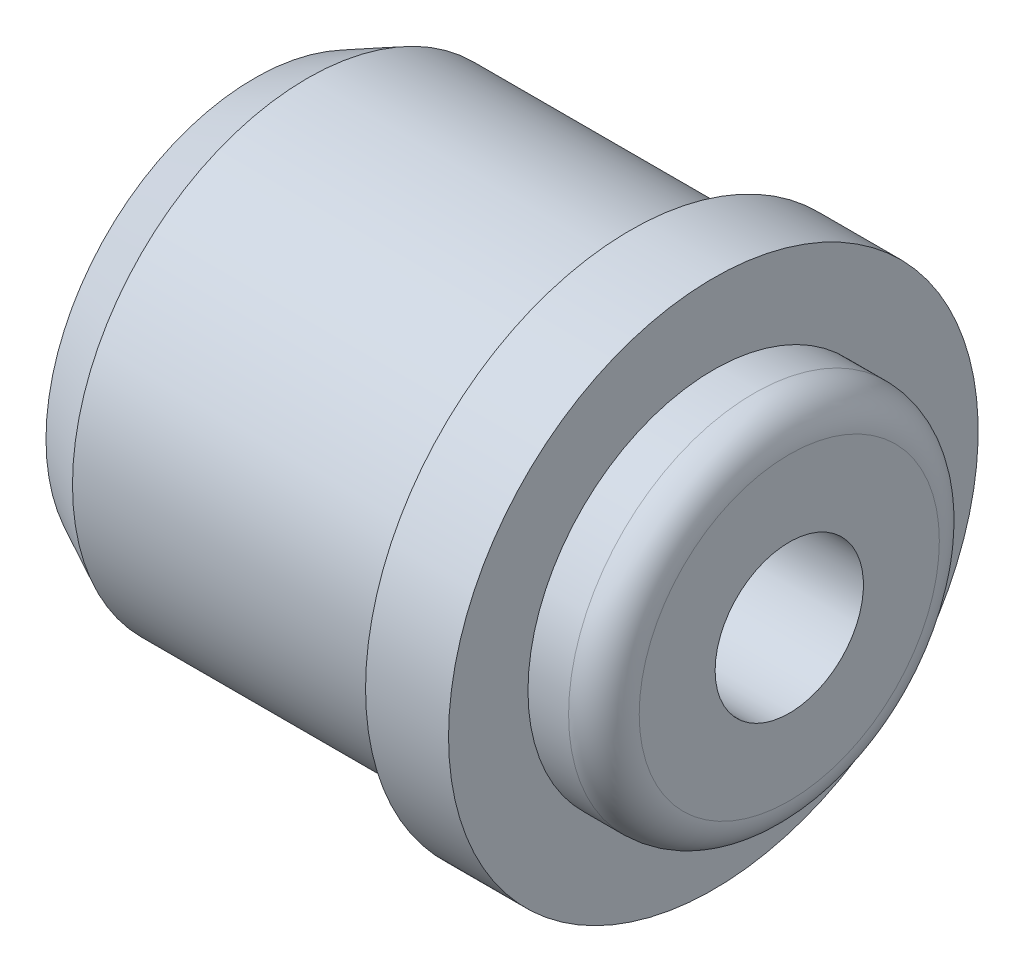
ISO-10303-21;
HEADER;
FILE_DESCRIPTION(('STEP AP214'),'2;1');
FILE_NAME('part.step','',(''),(''),'','','');
FILE_SCHEMA(('AUTOMOTIVE_DESIGN { 1 0 10303 214 1 1 1 1 }'));
ENDSEC;
DATA;
#1=APPLICATION_CONTEXT('core data for automotive mechanical design processes');
#2=APPLICATION_PROTOCOL_DEFINITION('international standard','automotive_design',2000,#1);
#3=PRODUCT_CONTEXT('',#1,'mechanical');
#4=PRODUCT('Part','Part','',(#3));
#5=PRODUCT_RELATED_PRODUCT_CATEGORY('part','',(#4));
#6=PRODUCT_DEFINITION_FORMATION('','',#4);
#7=PRODUCT_DEFINITION_CONTEXT('part definition',#1,'design');
#8=PRODUCT_DEFINITION('design','',#6,#7);
#9=PRODUCT_DEFINITION_SHAPE('','',#8);
#10=(LENGTH_UNIT() NAMED_UNIT(*) SI_UNIT(.MILLI.,.METRE.));
#11=(NAMED_UNIT(*) PLANE_ANGLE_UNIT() SI_UNIT($,.RADIAN.));
#12=(NAMED_UNIT(*) SI_UNIT($,.STERADIAN.) SOLID_ANGLE_UNIT());
#13=UNCERTAINTY_MEASURE_WITH_UNIT(LENGTH_MEASURE(1.E-05),#10,'distance_accuracy_value','');
#14=(GEOMETRIC_REPRESENTATION_CONTEXT(3) GLOBAL_UNCERTAINTY_ASSIGNED_CONTEXT((#13)) GLOBAL_UNIT_ASSIGNED_CONTEXT((#10,
#11,#12)) REPRESENTATION_CONTEXT('',''));
#15=CARTESIAN_POINT('',(0.,0.,0.));
#16=DIRECTION('',(0.,0.,1.));
#17=DIRECTION('',(1.,0.,0.));
#18=AXIS2_PLACEMENT_3D('',#15,#16,#17);
#19=CARTESIAN_POINT('',(-62.970585651958,0.,0.));
#20=DIRECTION('',(-1.,0.,0.));
#21=DIRECTION('',(0.,0.,1.));
#22=AXIS2_PLACEMENT_3D('',#19,#20,#21);
#23=CYLINDRICAL_SURFACE('',#22,11.3);
#24=CARTESIAN_POINT('',(-6.3,0.,0.));
#25=DIRECTION('',(-1.,0.,0.));
#26=DIRECTION('',(0.,0.,1.));
#27=AXIS2_PLACEMENT_3D('',#24,#25,#26);
#28=CIRCLE('',#27,11.3);
#29=CARTESIAN_POINT('',(-6.3,0.,11.3));
#30=VERTEX_POINT('',#29);
#31=EDGE_CURVE('E41',#30,#30,#28,.T.);
#32=ORIENTED_EDGE('',*,*,#31,.F.);
#33=EDGE_LOOP('',(#32));
#34=FACE_BOUND('',#33,.T.);
#35=CARTESIAN_POINT('',(-30.3,0.,0.));
#36=DIRECTION('',(-1.,0.,0.));
#37=DIRECTION('',(0.,0.,1.));
#38=AXIS2_PLACEMENT_3D('',#35,#36,#37);
#39=CIRCLE('',#38,11.3);
#40=CARTESIAN_POINT('',(-30.3,0.,11.3));
#41=VERTEX_POINT('',#40);
#42=EDGE_CURVE('E86',#41,#41,#39,.T.);
#43=ORIENTED_EDGE('',*,*,#42,.T.);
#44=EDGE_LOOP('',(#43));
#45=FACE_BOUND('',#44,.T.);
#46=ADVANCED_FACE('F31',(#34,#45),#23,.F.);
#47=CARTESIAN_POINT('',(-6.3,8.75,0.));
#48=DIRECTION('',(1.,0.,0.));
#49=DIRECTION('',(0.,0.,-1.));
#50=AXIS2_PLACEMENT_3D('',#47,#48,#49);
#51=PLANE('',#50);
#52=CARTESIAN_POINT('',(-6.3,0.,0.));
#53=DIRECTION('',(-1.,0.,0.));
#54=DIRECTION('',(0.,0.,1.));
#55=AXIS2_PLACEMENT_3D('',#52,#53,#54);
#56=CIRCLE('',#55,8.75);
#57=CARTESIAN_POINT('',(-6.3,0.,8.75));
#58=VERTEX_POINT('',#57);
#59=EDGE_CURVE('E45',#58,#58,#56,.T.);
#60=ORIENTED_EDGE('',*,*,#59,.F.);
#61=EDGE_LOOP('',(#60));
#62=FACE_BOUND('',#61,.T.);
#63=ORIENTED_EDGE('',*,*,#31,.T.);
#64=EDGE_LOOP('',(#63));
#65=FACE_BOUND('',#64,.T.);
#66=ADVANCED_FACE('F138',(#62,#65),#51,.F.);
#67=CARTESIAN_POINT('',(-62.970585651958,0.,0.));
#68=DIRECTION('',(-1.,0.,0.));
#69=DIRECTION('',(0.,0.,1.));
#70=AXIS2_PLACEMENT_3D('',#67,#68,#69);
#71=CYLINDRICAL_SURFACE('',#70,8.75);
#72=CARTESIAN_POINT('',(-20.8,0.,0.));
#73=DIRECTION('',(-1.,0.,0.));
#74=DIRECTION('',(0.,0.,1.));
#75=AXIS2_PLACEMENT_3D('',#72,#73,#74);
#76=CIRCLE('',#75,8.75);
#77=CARTESIAN_POINT('',(-20.8,0.,8.75));
#78=VERTEX_POINT('',#77);
#79=EDGE_CURVE('E50',#78,#78,#76,.T.);
#80=ORIENTED_EDGE('',*,*,#79,.F.);
#81=EDGE_LOOP('',(#80));
#82=FACE_BOUND('',#81,.T.);
#83=ORIENTED_EDGE('',*,*,#59,.T.);
#84=EDGE_LOOP('',(#83));
#85=FACE_BOUND('',#84,.T.);
#86=ADVANCED_FACE('F143',(#82,#85),#71,.T.);
#87=CARTESIAN_POINT('',(-20.8,7.2,0.));
#88=DIRECTION('',(1.,0.,0.));
#89=DIRECTION('',(0.,0.,-1.));
#90=AXIS2_PLACEMENT_3D('',#87,#88,#89);
#91=PLANE('',#90);
#92=CARTESIAN_POINT('',(-20.8,0.,0.));
#93=DIRECTION('',(-1.,0.,0.));
#94=DIRECTION('',(0.,0.,1.));
#95=AXIS2_PLACEMENT_3D('',#92,#93,#94);
#96=CIRCLE('',#95,7.2);
#97=CARTESIAN_POINT('',(-20.8,0.,7.2));
#98=VERTEX_POINT('',#97);
#99=EDGE_CURVE('E53',#98,#98,#96,.T.);
#100=ORIENTED_EDGE('',*,*,#99,.F.);
#101=EDGE_LOOP('',(#100));
#102=FACE_BOUND('',#101,.T.);
#103=ORIENTED_EDGE('',*,*,#79,.T.);
#104=EDGE_LOOP('',(#103));
#105=FACE_BOUND('',#104,.T.);
#106=ADVANCED_FACE('F150',(#102,#105),#91,.F.);
#107=CARTESIAN_POINT('',(-62.970585651958,0.,0.));
#108=DIRECTION('',(-1.,0.,0.));
#109=DIRECTION('',(0.,0.,1.));
#110=AXIS2_PLACEMENT_3D('',#107,#108,#109);
#111=CYLINDRICAL_SURFACE('',#110,7.2);
#112=CARTESIAN_POINT('',(-23.8,0.,0.));
#113=DIRECTION('',(-1.,0.,0.));
#114=DIRECTION('',(0.,0.,1.));
#115=AXIS2_PLACEMENT_3D('',#112,#113,#114);
#116=CIRCLE('',#115,7.2);
#117=CARTESIAN_POINT('',(-23.8,0.,7.2));
#118=VERTEX_POINT('',#117);
#119=EDGE_CURVE('E56',#118,#118,#116,.T.);
#120=ORIENTED_EDGE('',*,*,#119,.F.);
#121=EDGE_LOOP('',(#120));
#122=FACE_BOUND('',#121,.T.);
#123=ORIENTED_EDGE('',*,*,#99,.T.);
#124=EDGE_LOOP('',(#123));
#125=FACE_BOUND('',#124,.T.);
#126=ADVANCED_FACE('F157',(#122,#125),#111,.T.);
#127=CARTESIAN_POINT('',(-23.8,0.,0.));
#128=DIRECTION('',(1.,0.,0.));
#129=DIRECTION('',(0.,0.,-1.));
#130=AXIS2_PLACEMENT_3D('',#127,#128,#129);
#131=CONICAL_SURFACE('',#130,7.2,0.785398163397446);
#132=CARTESIAN_POINT('',(-25.3,0.,0.));
#133=DIRECTION('',(-1.,0.,0.));
#134=DIRECTION('',(0.,0.,1.));
#135=AXIS2_PLACEMENT_3D('',#132,#133,#134);
#136=CIRCLE('',#135,5.7);
#137=CARTESIAN_POINT('',(-25.3,0.,5.7));
#138=VERTEX_POINT('',#137);
#139=EDGE_CURVE('E59',#138,#138,#136,.T.);
#140=ORIENTED_EDGE('',*,*,#139,.F.);
#141=EDGE_LOOP('',(#140));
#142=FACE_BOUND('',#141,.T.);
#143=ORIENTED_EDGE('',*,*,#119,.T.);
#144=EDGE_LOOP('',(#143));
#145=FACE_BOUND('',#144,.T.);
#146=ADVANCED_FACE('F161',(#142,#145),#131,.T.);
#147=CARTESIAN_POINT('',(-25.3,4.2,0.));
#148=DIRECTION('',(1.,0.,0.));
#149=DIRECTION('',(0.,0.,-1.));
#150=AXIS2_PLACEMENT_3D('',#147,#148,#149);
#151=PLANE('',#150);
#152=CARTESIAN_POINT('',(-25.3,0.,0.));
#153=DIRECTION('',(-1.,0.,0.));
#154=DIRECTION('',(0.,0.,1.));
#155=AXIS2_PLACEMENT_3D('',#152,#153,#154);
#156=CIRCLE('',#155,4.2);
#157=CARTESIAN_POINT('',(-25.3,0.,4.2));
#158=VERTEX_POINT('',#157);
#159=EDGE_CURVE('E62',#158,#158,#156,.T.);
#160=ORIENTED_EDGE('',*,*,#159,.F.);
#161=EDGE_LOOP('',(#160));
#162=FACE_BOUND('',#161,.T.);
#163=ORIENTED_EDGE('',*,*,#139,.T.);
#164=EDGE_LOOP('',(#163));
#165=FACE_BOUND('',#164,.T.);
#166=ADVANCED_FACE('F165',(#162,#165),#151,.F.);
#167=CARTESIAN_POINT('',(-62.970585651958,0.,0.));
#168=DIRECTION('',(-1.,0.,0.));
#169=DIRECTION('',(0.,0.,1.));
#170=AXIS2_PLACEMENT_3D('',#167,#168,#169);
#171=CYLINDRICAL_SURFACE('',#170,4.2);
#172=CARTESIAN_POINT('',(0.,0.,0.));
#173=DIRECTION('',(-1.,0.,0.));
#174=DIRECTION('',(0.,0.,1.));
#175=AXIS2_PLACEMENT_3D('',#172,#173,#174);
#176=CIRCLE('',#175,4.2);
#177=CARTESIAN_POINT('',(0.,0.,4.2));
#178=VERTEX_POINT('',#177);
#179=EDGE_CURVE('E65',#178,#178,#176,.T.);
#180=ORIENTED_EDGE('',*,*,#179,.F.);
#181=EDGE_LOOP('',(#180));
#182=FACE_BOUND('',#181,.T.);
#183=ORIENTED_EDGE('',*,*,#159,.T.);
#184=EDGE_LOOP('',(#183));
#185=FACE_BOUND('',#184,.T.);
#186=ADVANCED_FACE('F135',(#182,#185),#171,.F.);
#187=CARTESIAN_POINT('',(0.,10.5,0.));
#188=DIRECTION('',(-1.,0.,0.));
#189=DIRECTION('',(0.,0.,1.));
#190=AXIS2_PLACEMENT_3D('',#187,#188,#189);
#191=PLANE('',#190);
#192=CARTESIAN_POINT('',(0.,0.,0.));
#193=DIRECTION('',(-1.,0.,0.));
#194=DIRECTION('',(0.,0.,1.));
#195=AXIS2_PLACEMENT_3D('',#192,#193,#194);
#196=CIRCLE('',#195,8.5);
#197=CARTESIAN_POINT('',(0.,0.,8.5));
#198=VERTEX_POINT('',#197);
#199=EDGE_CURVE('E10',#198,#198,#196,.F.);
#200=ORIENTED_EDGE('',*,*,#199,.T.);
#201=EDGE_LOOP('',(#200));
#202=FACE_BOUND('',#201,.T.);
#203=ORIENTED_EDGE('',*,*,#179,.T.);
#204=EDGE_LOOP('',(#203));
#205=FACE_BOUND('',#204,.T.);
#206=ADVANCED_FACE('F130',(#202,#205),#191,.F.);
#207=CARTESIAN_POINT('',(-62.970585651958,0.,0.));
#208=DIRECTION('',(-1.,0.,0.));
#209=DIRECTION('',(0.,0.,1.));
#210=AXIS2_PLACEMENT_3D('',#207,#208,#209);
#211=CYLINDRICAL_SURFACE('',#210,10.5);
#212=CARTESIAN_POINT('',(-2.,0.,0.));
#213=DIRECTION('',(-1.,0.,0.));
#214=DIRECTION('',(0.,0.,1.));
#215=AXIS2_PLACEMENT_3D('',#212,#213,#214);
#216=CIRCLE('',#215,10.5);
#217=CARTESIAN_POINT('',(-2.,0.,10.5));
#218=VERTEX_POINT('',#217);
#219=EDGE_CURVE('E37',#218,#218,#216,.T.);
#220=ORIENTED_EDGE('',*,*,#219,.T.);
#221=EDGE_LOOP('',(#220));
#222=FACE_BOUND('',#221,.T.);
#223=CARTESIAN_POINT('',(-4.3,0.,0.));
#224=DIRECTION('',(-1.,0.,0.));
#225=DIRECTION('',(0.,0.,1.));
#226=AXIS2_PLACEMENT_3D('',#223,#224,#225);
#227=CIRCLE('',#226,10.5);
#228=CARTESIAN_POINT('',(-4.3,0.,10.5));
#229=VERTEX_POINT('',#228);
#230=EDGE_CURVE('E68',#229,#229,#227,.T.);
#231=ORIENTED_EDGE('',*,*,#230,.F.);
#232=EDGE_LOOP('',(#231));
#233=FACE_BOUND('',#232,.T.);
#234=ADVANCED_FACE('F125',(#222,#233),#211,.T.);
#235=CARTESIAN_POINT('',(-4.3,15.,0.));
#236=DIRECTION('',(-1.,0.,0.));
#237=DIRECTION('',(0.,0.,1.));
#238=AXIS2_PLACEMENT_3D('',#235,#236,#237);
#239=PLANE('',#238);
#240=CARTESIAN_POINT('',(-4.3,0.,0.));
#241=DIRECTION('',(-1.,0.,0.));
#242=DIRECTION('',(0.,0.,1.));
#243=AXIS2_PLACEMENT_3D('',#240,#241,#242);
#244=CIRCLE('',#243,15.);
#245=CARTESIAN_POINT('',(-4.3,0.,15.));
#246=VERTEX_POINT('',#245);
#247=EDGE_CURVE('E71',#246,#246,#244,.T.);
#248=ORIENTED_EDGE('',*,*,#247,.F.);
#249=EDGE_LOOP('',(#248));
#250=FACE_BOUND('',#249,.T.);
#251=ORIENTED_EDGE('',*,*,#230,.T.);
#252=EDGE_LOOP('',(#251));
#253=FACE_BOUND('',#252,.T.);
#254=ADVANCED_FACE('F119',(#250,#253),#239,.F.);
#255=CARTESIAN_POINT('',(-62.970585651958,0.,0.));
#256=DIRECTION('',(-1.,0.,0.));
#257=DIRECTION('',(0.,0.,1.));
#258=AXIS2_PLACEMENT_3D('',#255,#256,#257);
#259=CYLINDRICAL_SURFACE('',#258,15.);
#260=CARTESIAN_POINT('',(-9.,0.,0.));
#261=DIRECTION('',(-1.,0.,0.));
#262=DIRECTION('',(0.,0.,1.));
#263=AXIS2_PLACEMENT_3D('',#260,#261,#262);
#264=CIRCLE('',#263,15.);
#265=CARTESIAN_POINT('',(-9.,0.,15.));
#266=VERTEX_POINT('',#265);
#267=EDGE_CURVE('E74',#266,#266,#264,.T.);
#268=ORIENTED_EDGE('',*,*,#267,.F.);
#269=EDGE_LOOP('',(#268));
#270=FACE_BOUND('',#269,.T.);
#271=ORIENTED_EDGE('',*,*,#247,.T.);
#272=EDGE_LOOP('',(#271));
#273=FACE_BOUND('',#272,.T.);
#274=ADVANCED_FACE('F113',(#270,#273),#259,.T.);
#275=CARTESIAN_POINT('',(-9.,13.3,0.));
#276=DIRECTION('',(1.,0.,0.));
#277=DIRECTION('',(0.,0.,-1.));
#278=AXIS2_PLACEMENT_3D('',#275,#276,#277);
#279=PLANE('',#278);
#280=CARTESIAN_POINT('',(-9.,0.,0.));
#281=DIRECTION('',(-1.,0.,0.));
#282=DIRECTION('',(0.,0.,1.));
#283=AXIS2_PLACEMENT_3D('',#280,#281,#282);
#284=CIRCLE('',#283,13.3);
#285=CARTESIAN_POINT('',(-9.,0.,13.3));
#286=VERTEX_POINT('',#285);
#287=EDGE_CURVE('E77',#286,#286,#284,.T.);
#288=ORIENTED_EDGE('',*,*,#287,.F.);
#289=EDGE_LOOP('',(#288));
#290=FACE_BOUND('',#289,.T.);
#291=ORIENTED_EDGE('',*,*,#267,.T.);
#292=EDGE_LOOP('',(#291));
#293=FACE_BOUND('',#292,.T.);
#294=ADVANCED_FACE('F107',(#290,#293),#279,.F.);
#295=CARTESIAN_POINT('',(-62.970585651958,0.,0.));
#296=DIRECTION('',(-1.,0.,0.));
#297=DIRECTION('',(0.,0.,1.));
#298=AXIS2_PLACEMENT_3D('',#295,#296,#297);
#299=CYLINDRICAL_SURFACE('',#298,13.3);
#300=CARTESIAN_POINT('',(-27.3,0.,0.));
#301=DIRECTION('',(-1.,0.,0.));
#302=DIRECTION('',(0.,0.,1.));
#303=AXIS2_PLACEMENT_3D('',#300,#301,#302);
#304=CIRCLE('',#303,13.3);
#305=CARTESIAN_POINT('',(-27.3,0.,13.3));
#306=VERTEX_POINT('',#305);
#307=EDGE_CURVE('E80',#306,#306,#304,.T.);
#308=ORIENTED_EDGE('',*,*,#307,.F.);
#309=EDGE_LOOP('',(#308));
#310=FACE_BOUND('',#309,.T.);
#311=ORIENTED_EDGE('',*,*,#287,.T.);
#312=EDGE_LOOP('',(#311));
#313=FACE_BOUND('',#312,.T.);
#314=ADVANCED_FACE('F101',(#310,#313),#299,.T.);
#315=CARTESIAN_POINT('',(-27.3,0.,0.));
#316=DIRECTION('',(1.,0.,0.));
#317=DIRECTION('',(0.,0.,-1.));
#318=AXIS2_PLACEMENT_3D('',#315,#316,#317);
#319=CONICAL_SURFACE('',#318,13.3,0.463647609000807);
#320=CARTESIAN_POINT('',(-30.3,0.,0.));
#321=DIRECTION('',(-1.,0.,0.));
#322=DIRECTION('',(0.,0.,1.));
#323=AXIS2_PLACEMENT_3D('',#320,#321,#322);
#324=CIRCLE('',#323,11.8);
#325=CARTESIAN_POINT('',(-30.3,0.,11.8));
#326=VERTEX_POINT('',#325);
#327=EDGE_CURVE('E83',#326,#326,#324,.T.);
#328=ORIENTED_EDGE('',*,*,#327,.F.);
#329=EDGE_LOOP('',(#328));
#330=FACE_BOUND('',#329,.T.);
#331=ORIENTED_EDGE('',*,*,#307,.T.);
#332=EDGE_LOOP('',(#331));
#333=FACE_BOUND('',#332,.T.);
#334=ADVANCED_FACE('F95',(#330,#333),#319,.T.);
#335=CARTESIAN_POINT('',(-30.3,11.3,0.));
#336=DIRECTION('',(1.,0.,0.));
#337=DIRECTION('',(0.,0.,-1.));
#338=AXIS2_PLACEMENT_3D('',#335,#336,#337);
#339=PLANE('',#338);
#340=ORIENTED_EDGE('',*,*,#42,.F.);
#341=EDGE_LOOP('',(#340));
#342=FACE_BOUND('',#341,.T.);
#343=ORIENTED_EDGE('',*,*,#327,.T.);
#344=EDGE_LOOP('',(#343));
#345=FACE_BOUND('',#344,.T.);
#346=ADVANCED_FACE('F91',(#342,#345),#339,.F.);
#347=CARTESIAN_POINT('',(-2.,0.,0.));
#348=DIRECTION('',(-1.,0.,0.));
#349=DIRECTION('',(0.,0.,1.));
#350=AXIS2_PLACEMENT_3D('',#347,#348,#349);
#351=TOROIDAL_SURFACE('',#350,8.5,2.);
#352=ORIENTED_EDGE('',*,*,#199,.F.);
#353=EDGE_LOOP('',(#352));
#354=FACE_BOUND('',#353,.T.);
#355=ORIENTED_EDGE('',*,*,#219,.F.);
#356=EDGE_LOOP('',(#355));
#357=FACE_BOUND('',#356,.T.);
#358=ADVANCED_FACE('F94',(#354,#357),#351,.T.);
#359=CLOSED_SHELL('',(#46,#66,#86,#106,#126,#146,#166,#186,#206,#234,#254,#274,#294,#314,#334,
#346,#358));
#360=MANIFOLD_SOLID_BREP('B2',#359);
#361=ADVANCED_BREP_SHAPE_REPRESENTATION('',(#18,#360),#14);
#362=SHAPE_DEFINITION_REPRESENTATION(#9,#361);
ENDSEC;
END-ISO-10303-21;
